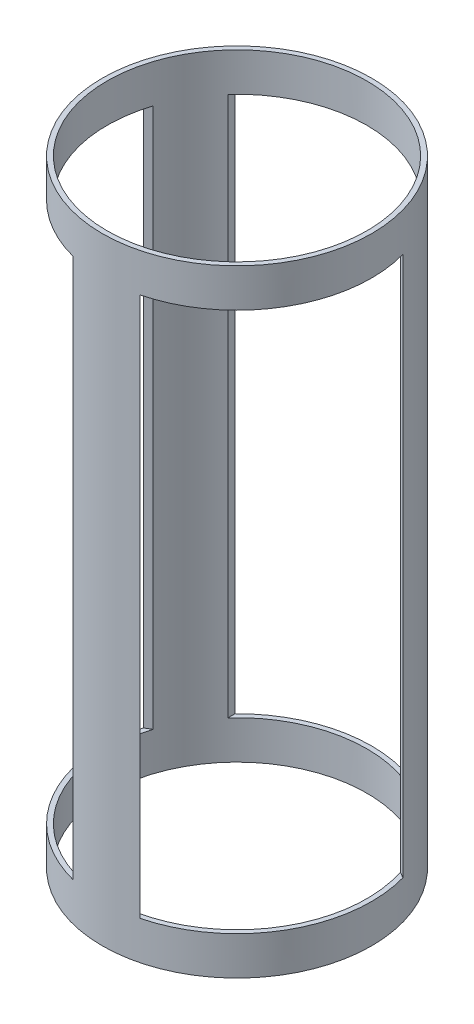
ISO-10303-21;
HEADER;
FILE_DESCRIPTION(('STEP AP214'),'2;1');
FILE_NAME('part.step','',(''),(''),'','','');
FILE_SCHEMA(('AUTOMOTIVE_DESIGN { 1 0 10303 214 1 1 1 1 }'));
ENDSEC;
DATA;
#1=APPLICATION_CONTEXT('core data for automotive mechanical design processes');
#2=APPLICATION_PROTOCOL_DEFINITION('international standard','automotive_design',2000,#1);
#3=PRODUCT_CONTEXT('',#1,'mechanical');
#4=PRODUCT('Part','Part','',(#3));
#5=PRODUCT_RELATED_PRODUCT_CATEGORY('part','',(#4));
#6=PRODUCT_DEFINITION_FORMATION('','',#4);
#7=PRODUCT_DEFINITION_CONTEXT('part definition',#1,'design');
#8=PRODUCT_DEFINITION('design','',#6,#7);
#9=PRODUCT_DEFINITION_SHAPE('','',#8);
#10=(LENGTH_UNIT() NAMED_UNIT(*) SI_UNIT(.MILLI.,.METRE.));
#11=(NAMED_UNIT(*) PLANE_ANGLE_UNIT() SI_UNIT($,.RADIAN.));
#12=(NAMED_UNIT(*) SI_UNIT($,.STERADIAN.) SOLID_ANGLE_UNIT());
#13=UNCERTAINTY_MEASURE_WITH_UNIT(LENGTH_MEASURE(1.E-05),#10,'distance_accuracy_value','');
#14=(GEOMETRIC_REPRESENTATION_CONTEXT(3) GLOBAL_UNCERTAINTY_ASSIGNED_CONTEXT((#13)) GLOBAL_UNIT_ASSIGNED_CONTEXT((#10,
#11,#12)) REPRESENTATION_CONTEXT('',''));
#15=CARTESIAN_POINT('',(0.,0.,0.));
#16=DIRECTION('',(0.,0.,1.));
#17=DIRECTION('',(1.,0.,0.));
#18=AXIS2_PLACEMENT_3D('',#15,#16,#17);
#19=CARTESIAN_POINT('',(0.,203.581,0.));
#20=DIRECTION('',(0.,1.,0.));
#21=DIRECTION('',(0.,0.,1.));
#22=AXIS2_PLACEMENT_3D('',#19,#20,#21);
#23=PLANE('',#22);
#24=CARTESIAN_POINT('',(0.,203.581,0.));
#25=DIRECTION('',(0.,1.,0.));
#26=DIRECTION('',(0.,0.,1.));
#27=AXIS2_PLACEMENT_3D('',#24,#25,#26);
#28=CIRCLE('',#27,88.9);
#29=CARTESIAN_POINT('',(0.,203.581,88.9));
#30=VERTEX_POINT('',#29);
#31=EDGE_CURVE('E226',#30,#30,#28,.T.);
#32=ORIENTED_EDGE('',*,*,#31,.T.);
#33=EDGE_LOOP('',(#32));
#34=FACE_BOUND('',#33,.T.);
#35=CARTESIAN_POINT('',(0.,203.581,0.));
#36=DIRECTION('',(0.,1.,0.));
#37=DIRECTION('',(0.,0.,1.));
#38=AXIS2_PLACEMENT_3D('',#35,#36,#37);
#39=CIRCLE('',#38,85.725);
#40=CARTESIAN_POINT('',(0.,203.581,85.725));
#41=VERTEX_POINT('',#40);
#42=EDGE_CURVE('E220',#41,#41,#39,.T.);
#43=ORIENTED_EDGE('',*,*,#42,.F.);
#44=EDGE_LOOP('',(#43));
#45=FACE_BOUND('',#44,.T.);
#46=ADVANCED_FACE('F41',(#34,#45),#23,.T.);
#47=CARTESIAN_POINT('',(0.,-203.581,0.));
#48=DIRECTION('',(0.,1.,0.));
#49=DIRECTION('',(0.,0.,1.));
#50=AXIS2_PLACEMENT_3D('',#47,#48,#49);
#51=PLANE('',#50);
#52=CARTESIAN_POINT('',(0.,-203.581,0.));
#53=DIRECTION('',(0.,1.,0.));
#54=DIRECTION('',(0.,0.,1.));
#55=AXIS2_PLACEMENT_3D('',#52,#53,#54);
#56=CIRCLE('',#55,88.9);
#57=CARTESIAN_POINT('',(0.,-203.581,88.9));
#58=VERTEX_POINT('',#57);
#59=EDGE_CURVE('E223',#58,#58,#56,.T.);
#60=ORIENTED_EDGE('',*,*,#59,.F.);
#61=EDGE_LOOP('',(#60));
#62=FACE_BOUND('',#61,.T.);
#63=CARTESIAN_POINT('',(0.,-203.581,0.));
#64=DIRECTION('',(0.,1.,0.));
#65=DIRECTION('',(0.,0.,1.));
#66=AXIS2_PLACEMENT_3D('',#63,#64,#65);
#67=CIRCLE('',#66,85.725);
#68=CARTESIAN_POINT('',(0.,-203.581,85.725));
#69=VERTEX_POINT('',#68);
#70=EDGE_CURVE('E200',#69,#69,#67,.T.);
#71=ORIENTED_EDGE('',*,*,#70,.T.);
#72=EDGE_LOOP('',(#71));
#73=FACE_BOUND('',#72,.T.);
#74=ADVANCED_FACE('F256',(#62,#73),#51,.F.);
#75=CARTESIAN_POINT('',(0.,203.581,0.));
#76=DIRECTION('',(0.,-1.,0.));
#77=DIRECTION('',(0.,0.,-1.));
#78=AXIS2_PLACEMENT_3D('',#75,#76,#77);
#79=CYLINDRICAL_SURFACE('',#78,88.9);
#80=CARTESIAN_POINT('',(0.,-178.181,0.));
#81=DIRECTION('',(0.,-1.,0.));
#82=DIRECTION('',(0.866025403784436,0.,0.500000000000004));
#83=AXIS2_PLACEMENT_3D('',#80,#81,#82);
#84=CIRCLE('',#83,88.9);
#85=CARTESIAN_POINT('',(22.1315367264145,-178.181,86.1011328736583));
#86=VERTEX_POINT('',#85);
#87=CARTESIAN_POINT('',(85.631536726415,-178.181,-23.8840934069651));
#88=VERTEX_POINT('',#87);
#89=EDGE_CURVE('E162',#86,#88,#84,.F.);
#90=ORIENTED_EDGE('',*,*,#89,.F.);
#91=DIRECTION('',(0.,-1.,0.));
#92=VECTOR('',#91,1.);
#93=CARTESIAN_POINT('',(22.1315367264145,203.581,86.1011328736583));
#94=LINE('',#93,#92);
#95=CARTESIAN_POINT('',(22.1315367264145,178.181,86.1011328736583));
#96=VERTEX_POINT('',#95);
#97=EDGE_CURVE('E167',#96,#86,#94,.T.);
#98=ORIENTED_EDGE('',*,*,#97,.F.);
#99=CARTESIAN_POINT('',(0.,178.181,0.));
#100=DIRECTION('',(0.,1.,0.));
#101=DIRECTION('',(-0.866025403784436,0.,-0.500000000000004));
#102=AXIS2_PLACEMENT_3D('',#99,#100,#101);
#103=CIRCLE('',#102,88.9);
#104=CARTESIAN_POINT('',(85.631536726415,178.181,-23.8840934069651));
#105=VERTEX_POINT('',#104);
#106=EDGE_CURVE('E141',#105,#96,#103,.F.);
#107=ORIENTED_EDGE('',*,*,#106,.F.);
#108=DIRECTION('',(0.,-1.,0.));
#109=VECTOR('',#108,1.);
#110=CARTESIAN_POINT('',(85.631536726415,203.581,-23.8840934069651));
#111=LINE('',#110,#109);
#112=EDGE_CURVE('E56',#88,#105,#111,.F.);
#113=ORIENTED_EDGE('',*,*,#112,.F.);
#114=EDGE_LOOP('',(#90,#98,#107,#113));
#115=FACE_BOUND('',#114,.T.);
#116=CARTESIAN_POINT('',(0.,-178.181,0.));
#117=DIRECTION('',(0.,-1.,0.));
#118=DIRECTION('',(-0.866025403784443,0.,0.499999999999992));
#119=AXIS2_PLACEMENT_3D('',#116,#117,#118);
#120=CIRCLE('',#119,88.9);
#121=CARTESIAN_POINT('',(-85.6315367264147,-178.181,-23.8840934069663));
#122=VERTEX_POINT('',#121);
#123=CARTESIAN_POINT('',(-22.1315367264157,-178.181,86.101132873658));
#124=VERTEX_POINT('',#123);
#125=EDGE_CURVE('E191',#122,#124,#120,.F.);
#126=ORIENTED_EDGE('',*,*,#125,.F.);
#127=DIRECTION('',(0.,-1.,0.));
#128=VECTOR('',#127,1.);
#129=CARTESIAN_POINT('',(-85.6315367264147,203.581,-23.8840934069663));
#130=LINE('',#129,#128);
#131=CARTESIAN_POINT('',(-85.6315367264147,178.181,-23.8840934069663));
#132=VERTEX_POINT('',#131);
#133=EDGE_CURVE('E142',#132,#122,#130,.T.);
#134=ORIENTED_EDGE('',*,*,#133,.F.);
#135=CARTESIAN_POINT('',(0.,178.181,0.));
#136=DIRECTION('',(0.,1.,0.));
#137=DIRECTION('',(0.866025403784443,0.,-0.499999999999992));
#138=AXIS2_PLACEMENT_3D('',#135,#136,#137);
#139=CIRCLE('',#138,88.9);
#140=CARTESIAN_POINT('',(-22.1315367264157,178.181,86.101132873658));
#141=VERTEX_POINT('',#140);
#142=EDGE_CURVE('E173',#141,#132,#139,.F.);
#143=ORIENTED_EDGE('',*,*,#142,.F.);
#144=DIRECTION('',(0.,-1.,0.));
#145=VECTOR('',#144,1.);
#146=CARTESIAN_POINT('',(-22.1315367264157,203.581,86.101132873658));
#147=LINE('',#146,#145);
#148=EDGE_CURVE('E64',#124,#141,#147,.F.);
#149=ORIENTED_EDGE('',*,*,#148,.F.);
#150=EDGE_LOOP('',(#126,#134,#143,#149));
#151=FACE_BOUND('',#150,.T.);
#152=CARTESIAN_POINT('',(0.,-178.181,0.));
#153=DIRECTION('',(0.,-1.,0.));
#154=DIRECTION('',(0.,0.,-1.));
#155=AXIS2_PLACEMENT_3D('',#152,#153,#154);
#156=CIRCLE('',#155,88.9);
#157=CARTESIAN_POINT('',(63.5,-178.181,-62.2170394666927));
#158=VERTEX_POINT('',#157);
#159=CARTESIAN_POINT('',(-63.5,-178.181,-62.2170394666927));
#160=VERTEX_POINT('',#159);
#161=EDGE_CURVE('E201',#158,#160,#156,.F.);
#162=ORIENTED_EDGE('',*,*,#161,.F.);
#163=DIRECTION('',(0.,-1.,0.));
#164=VECTOR('',#163,1.);
#165=CARTESIAN_POINT('',(63.5,203.581,-62.2170394666927));
#166=LINE('',#165,#164);
#167=CARTESIAN_POINT('',(63.5,178.181,-62.2170394666927));
#168=VERTEX_POINT('',#167);
#169=EDGE_CURVE('E204',#168,#158,#166,.T.);
#170=ORIENTED_EDGE('',*,*,#169,.F.);
#171=CARTESIAN_POINT('',(0.,178.181,0.));
#172=DIRECTION('',(0.,1.,0.));
#173=DIRECTION('',(0.,0.,1.));
#174=AXIS2_PLACEMENT_3D('',#171,#172,#173);
#175=CIRCLE('',#174,88.9);
#176=CARTESIAN_POINT('',(-63.5,178.181,-62.2170394666927));
#177=VERTEX_POINT('',#176);
#178=EDGE_CURVE('E207',#177,#168,#175,.F.);
#179=ORIENTED_EDGE('',*,*,#178,.F.);
#180=DIRECTION('',(0.,-1.,0.));
#181=VECTOR('',#180,1.);
#182=CARTESIAN_POINT('',(-63.5,203.581,-62.2170394666927));
#183=LINE('',#182,#181);
#184=EDGE_CURVE('E198',#160,#177,#183,.F.);
#185=ORIENTED_EDGE('',*,*,#184,.F.);
#186=EDGE_LOOP('',(#162,#170,#179,#185));
#187=FACE_BOUND('',#186,.T.);
#188=ORIENTED_EDGE('',*,*,#31,.F.);
#189=EDGE_LOOP('',(#188));
#190=FACE_BOUND('',#189,.T.);
#191=ORIENTED_EDGE('',*,*,#59,.T.);
#192=EDGE_LOOP('',(#191));
#193=FACE_BOUND('',#192,.T.);
#194=ADVANCED_FACE('F43',(#115,#151,#187,#190,#193),#79,.T.);
#195=CARTESIAN_POINT('',(0.,203.581,0.));
#196=DIRECTION('',(0.,-1.,0.));
#197=DIRECTION('',(0.,0.,-1.));
#198=AXIS2_PLACEMENT_3D('',#195,#196,#197);
#199=CYLINDRICAL_SURFACE('',#198,85.725);
#200=DIRECTION('',(0.,-1.,0.));
#201=VECTOR('',#200,1.);
#202=CARTESIAN_POINT('',(18.1237828798855,203.581,83.787255111519));
#203=LINE('',#202,#201);
#204=CARTESIAN_POINT('',(18.1237828798855,-178.181,83.787255111519));
#205=VERTEX_POINT('',#204);
#206=CARTESIAN_POINT('',(18.1237828798855,178.181,83.787255111519));
#207=VERTEX_POINT('',#206);
#208=EDGE_CURVE('E165',#205,#207,#203,.F.);
#209=ORIENTED_EDGE('',*,*,#208,.F.);
#210=CARTESIAN_POINT('',(0.,-178.181,0.));
#211=DIRECTION('',(0.,-1.,0.));
#212=DIRECTION('',(0.866025403784436,0.,0.500000000000004));
#213=AXIS2_PLACEMENT_3D('',#210,#211,#212);
#214=CIRCLE('',#213,85.725);
#215=CARTESIAN_POINT('',(81.623782879886,-178.181,-26.1979711691044));
#216=VERTEX_POINT('',#215);
#217=EDGE_CURVE('E151',#216,#205,#214,.T.);
#218=ORIENTED_EDGE('',*,*,#217,.F.);
#219=DIRECTION('',(0.,-1.,0.));
#220=VECTOR('',#219,1.);
#221=CARTESIAN_POINT('',(81.623782879886,203.581,-26.1979711691044));
#222=LINE('',#221,#220);
#223=CARTESIAN_POINT('',(81.623782879886,178.181,-26.1979711691044));
#224=VERTEX_POINT('',#223);
#225=EDGE_CURVE('E145',#224,#216,#222,.T.);
#226=ORIENTED_EDGE('',*,*,#225,.F.);
#227=CARTESIAN_POINT('',(0.,178.181,0.));
#228=DIRECTION('',(0.,1.,0.));
#229=DIRECTION('',(-0.866025403784436,0.,-0.500000000000004));
#230=AXIS2_PLACEMENT_3D('',#227,#228,#229);
#231=CIRCLE('',#230,85.725);
#232=EDGE_CURVE('E132',#207,#224,#231,.T.);
#233=ORIENTED_EDGE('',*,*,#232,.F.);
#234=EDGE_LOOP('',(#209,#218,#226,#233));
#235=FACE_BOUND('',#234,.T.);
#236=DIRECTION('',(0.,-1.,0.));
#237=VECTOR('',#236,1.);
#238=CARTESIAN_POINT('',(-81.6237828798856,203.581,-26.1979711691055));
#239=LINE('',#238,#237);
#240=CARTESIAN_POINT('',(-81.6237828798856,-178.181,-26.1979711691055));
#241=VERTEX_POINT('',#240);
#242=CARTESIAN_POINT('',(-81.6237828798857,178.181,-26.1979711691055));
#243=VERTEX_POINT('',#242);
#244=EDGE_CURVE('E194',#241,#243,#239,.F.);
#245=ORIENTED_EDGE('',*,*,#244,.F.);
#246=CARTESIAN_POINT('',(0.,-178.181,0.));
#247=DIRECTION('',(0.,-1.,0.));
#248=DIRECTION('',(-0.866025403784443,0.,0.499999999999992));
#249=AXIS2_PLACEMENT_3D('',#246,#247,#248);
#250=CIRCLE('',#249,85.725);
#251=CARTESIAN_POINT('',(-18.1237828798867,-178.181,83.7872551115187));
#252=VERTEX_POINT('',#251);
#253=EDGE_CURVE('E186',#252,#241,#250,.T.);
#254=ORIENTED_EDGE('',*,*,#253,.F.);
#255=DIRECTION('',(0.,-1.,0.));
#256=VECTOR('',#255,1.);
#257=CARTESIAN_POINT('',(-18.1237828798867,203.581,83.7872551115187));
#258=LINE('',#257,#256);
#259=CARTESIAN_POINT('',(-18.1237828798867,178.181,83.7872551115187));
#260=VERTEX_POINT('',#259);
#261=EDGE_CURVE('E180',#260,#252,#258,.T.);
#262=ORIENTED_EDGE('',*,*,#261,.F.);
#263=CARTESIAN_POINT('',(0.,178.181,0.));
#264=DIRECTION('',(0.,1.,0.));
#265=DIRECTION('',(0.866025403784443,0.,-0.499999999999992));
#266=AXIS2_PLACEMENT_3D('',#263,#264,#265);
#267=CIRCLE('',#266,85.725);
#268=EDGE_CURVE('E171',#243,#260,#267,.T.);
#269=ORIENTED_EDGE('',*,*,#268,.F.);
#270=EDGE_LOOP('',(#245,#254,#262,#269));
#271=FACE_BOUND('',#270,.T.);
#272=DIRECTION('',(0.,-1.,0.));
#273=VECTOR('',#272,1.);
#274=CARTESIAN_POINT('',(63.5,203.581,-57.5892839424141));
#275=LINE('',#274,#273);
#276=CARTESIAN_POINT('',(63.5,-178.181,-57.5892839424141));
#277=VERTEX_POINT('',#276);
#278=CARTESIAN_POINT('',(63.5,178.181,-57.5892839424141));
#279=VERTEX_POINT('',#278);
#280=EDGE_CURVE('E11',#277,#279,#275,.F.);
#281=ORIENTED_EDGE('',*,*,#280,.F.);
#282=CARTESIAN_POINT('',(0.,-178.181,0.));
#283=DIRECTION('',(0.,-1.,0.));
#284=DIRECTION('',(0.,0.,-1.));
#285=AXIS2_PLACEMENT_3D('',#282,#283,#284);
#286=CIRCLE('',#285,85.725);
#287=CARTESIAN_POINT('',(-63.5,-178.181,-57.5892839424141));
#288=VERTEX_POINT('',#287);
#289=EDGE_CURVE('E49',#288,#277,#286,.T.);
#290=ORIENTED_EDGE('',*,*,#289,.F.);
#291=DIRECTION('',(0.,-1.,0.));
#292=VECTOR('',#291,1.);
#293=CARTESIAN_POINT('',(-63.5,203.581,-57.5892839424141));
#294=LINE('',#293,#292);
#295=CARTESIAN_POINT('',(-63.5,178.181,-57.5892839424141));
#296=VERTEX_POINT('',#295);
#297=EDGE_CURVE('E233',#296,#288,#294,.T.);
#298=ORIENTED_EDGE('',*,*,#297,.F.);
#299=CARTESIAN_POINT('',(0.,178.181,0.));
#300=DIRECTION('',(0.,1.,0.));
#301=DIRECTION('',(0.,0.,1.));
#302=AXIS2_PLACEMENT_3D('',#299,#300,#301);
#303=CIRCLE('',#302,85.725);
#304=EDGE_CURVE('E229',#279,#296,#303,.T.);
#305=ORIENTED_EDGE('',*,*,#304,.F.);
#306=EDGE_LOOP('',(#281,#290,#298,#305));
#307=FACE_BOUND('',#306,.T.);
#308=ORIENTED_EDGE('',*,*,#42,.T.);
#309=EDGE_LOOP('',(#308));
#310=FACE_BOUND('',#309,.T.);
#311=ORIENTED_EDGE('',*,*,#70,.F.);
#312=EDGE_LOOP('',(#311));
#313=FACE_BOUND('',#312,.T.);
#314=ADVANCED_FACE('F149',(#235,#271,#307,#310,#313),#199,.F.);
#315=CARTESIAN_POINT('',(63.5,-178.181,-88.901));
#316=DIRECTION('',(1.,0.,0.));
#317=DIRECTION('',(0.,0.,-1.));
#318=AXIS2_PLACEMENT_3D('',#315,#316,#317);
#319=PLANE('',#318);
#320=ORIENTED_EDGE('',*,*,#280,.T.);
#321=DIRECTION('',(0.,0.,1.));
#322=VECTOR('',#321,1.);
#323=CARTESIAN_POINT('',(63.5,178.181,-88.901));
#324=LINE('',#323,#322);
#325=EDGE_CURVE('E170',#168,#279,#324,.T.);
#326=ORIENTED_EDGE('',*,*,#325,.F.);
#327=ORIENTED_EDGE('',*,*,#169,.T.);
#328=DIRECTION('',(0.,0.,1.));
#329=VECTOR('',#328,1.);
#330=CARTESIAN_POINT('',(63.5,-178.181,-88.901));
#331=LINE('',#330,#329);
#332=EDGE_CURVE('E211',#158,#277,#331,.T.);
#333=ORIENTED_EDGE('',*,*,#332,.T.);
#334=EDGE_LOOP('',(#320,#326,#327,#333));
#335=FACE_BOUND('',#334,.T.);
#336=ADVANCED_FACE('F241',(#335),#319,.F.);
#337=CARTESIAN_POINT('',(-63.5,-178.181,-88.901));
#338=DIRECTION('',(0.,-1.,0.));
#339=DIRECTION('',(0.,0.,-1.));
#340=AXIS2_PLACEMENT_3D('',#337,#338,#339);
#341=PLANE('',#340);
#342=ORIENTED_EDGE('',*,*,#289,.T.);
#343=ORIENTED_EDGE('',*,*,#332,.F.);
#344=ORIENTED_EDGE('',*,*,#161,.T.);
#345=DIRECTION('',(0.,0.,1.));
#346=VECTOR('',#345,1.);
#347=CARTESIAN_POINT('',(-63.5,-178.181,-88.901));
#348=LINE('',#347,#346);
#349=EDGE_CURVE('E214',#160,#288,#348,.T.);
#350=ORIENTED_EDGE('',*,*,#349,.T.);
#351=EDGE_LOOP('',(#342,#343,#344,#350));
#352=FACE_BOUND('',#351,.T.);
#353=ADVANCED_FACE('F236',(#352),#341,.F.);
#354=CARTESIAN_POINT('',(-63.5,-178.181,-88.901));
#355=DIRECTION('',(-1.,0.,0.));
#356=DIRECTION('',(0.,0.,1.));
#357=AXIS2_PLACEMENT_3D('',#354,#355,#356);
#358=PLANE('',#357);
#359=ORIENTED_EDGE('',*,*,#297,.T.);
#360=ORIENTED_EDGE('',*,*,#349,.F.);
#361=ORIENTED_EDGE('',*,*,#184,.T.);
#362=DIRECTION('',(0.,0.,1.));
#363=VECTOR('',#362,1.);
#364=CARTESIAN_POINT('',(-63.5,178.181,-88.901));
#365=LINE('',#364,#363);
#366=EDGE_CURVE('E210',#177,#296,#365,.T.);
#367=ORIENTED_EDGE('',*,*,#366,.T.);
#368=EDGE_LOOP('',(#359,#360,#361,#367));
#369=FACE_BOUND('',#368,.T.);
#370=ADVANCED_FACE('F251',(#369),#358,.F.);
#371=CARTESIAN_POINT('',(-63.5,178.181,-88.901));
#372=DIRECTION('',(0.,1.,0.));
#373=DIRECTION('',(0.,0.,1.));
#374=AXIS2_PLACEMENT_3D('',#371,#372,#373);
#375=PLANE('',#374);
#376=ORIENTED_EDGE('',*,*,#304,.T.);
#377=ORIENTED_EDGE('',*,*,#366,.F.);
#378=ORIENTED_EDGE('',*,*,#178,.T.);
#379=ORIENTED_EDGE('',*,*,#325,.T.);
#380=EDGE_LOOP('',(#376,#377,#378,#379));
#381=FACE_BOUND('',#380,.T.);
#382=ADVANCED_FACE('F248',(#381),#375,.F.);
#383=CARTESIAN_POINT('',(-108.74052442184,-178.181,-10.5421131403129));
#384=DIRECTION('',(-0.499999999999992,0.,-0.866025403784443));
#385=DIRECTION('',(-0.866025403784443,0.,0.499999999999992));
#386=AXIS2_PLACEMENT_3D('',#383,#384,#385);
#387=PLANE('',#386);
#388=ORIENTED_EDGE('',*,*,#244,.T.);
#389=DIRECTION('',(0.866025403784443,0.,-0.499999999999992));
#390=VECTOR('',#389,1.);
#391=CARTESIAN_POINT('',(-108.74052442184,178.181,-10.5421131403129));
#392=LINE('',#391,#390);
#393=EDGE_CURVE('E177',#132,#243,#392,.T.);
#394=ORIENTED_EDGE('',*,*,#393,.F.);
#395=ORIENTED_EDGE('',*,*,#133,.T.);
#396=DIRECTION('',(0.866025403784443,0.,-0.499999999999992));
#397=VECTOR('',#396,1.);
#398=CARTESIAN_POINT('',(-108.74052442184,-178.181,-10.5421131403129));
#399=LINE('',#398,#397);
#400=EDGE_CURVE('E188',#122,#241,#399,.T.);
#401=ORIENTED_EDGE('',*,*,#400,.T.);
#402=EDGE_LOOP('',(#388,#394,#395,#401));
#403=FACE_BOUND('',#402,.T.);
#404=ADVANCED_FACE('F303',(#403),#387,.F.);
#405=CARTESIAN_POINT('',(-45.2405244218413,-178.181,99.4431131403114));
#406=DIRECTION('',(0.,-1.,0.));
#407=DIRECTION('',(-0.866025403784443,0.,0.499999999999992));
#408=AXIS2_PLACEMENT_3D('',#405,#406,#407);
#409=PLANE('',#408);
#410=ORIENTED_EDGE('',*,*,#253,.T.);
#411=ORIENTED_EDGE('',*,*,#400,.F.);
#412=ORIENTED_EDGE('',*,*,#125,.T.);
#413=DIRECTION('',(0.866025403784443,0.,-0.499999999999992));
#414=VECTOR('',#413,1.);
#415=CARTESIAN_POINT('',(-45.2405244218413,-178.181,99.4431131403114));
#416=LINE('',#415,#414);
#417=EDGE_CURVE('E182',#124,#252,#416,.T.);
#418=ORIENTED_EDGE('',*,*,#417,.T.);
#419=EDGE_LOOP('',(#410,#411,#412,#418));
#420=FACE_BOUND('',#419,.T.);
#421=ADVANCED_FACE('F308',(#420),#409,.F.);
#422=CARTESIAN_POINT('',(-45.2405244218413,-178.181,99.4431131403114));
#423=DIRECTION('',(0.499999999999992,0.,0.866025403784443));
#424=DIRECTION('',(0.866025403784443,0.,-0.499999999999992));
#425=AXIS2_PLACEMENT_3D('',#422,#423,#424);
#426=PLANE('',#425);
#427=ORIENTED_EDGE('',*,*,#261,.T.);
#428=ORIENTED_EDGE('',*,*,#417,.F.);
#429=ORIENTED_EDGE('',*,*,#148,.T.);
#430=DIRECTION('',(0.866025403784443,0.,-0.499999999999992));
#431=VECTOR('',#430,1.);
#432=CARTESIAN_POINT('',(-45.2405244218413,178.181,99.4431131403114));
#433=LINE('',#432,#431);
#434=EDGE_CURVE('E175',#141,#260,#433,.T.);
#435=ORIENTED_EDGE('',*,*,#434,.T.);
#436=EDGE_LOOP('',(#427,#428,#429,#435));
#437=FACE_BOUND('',#436,.T.);
#438=ADVANCED_FACE('F318',(#437),#426,.F.);
#439=CARTESIAN_POINT('',(-45.2405244218413,178.181,99.4431131403114));
#440=DIRECTION('',(0.,1.,0.));
#441=DIRECTION('',(0.866025403784443,0.,-0.499999999999992));
#442=AXIS2_PLACEMENT_3D('',#439,#440,#441);
#443=PLANE('',#442);
#444=ORIENTED_EDGE('',*,*,#268,.T.);
#445=ORIENTED_EDGE('',*,*,#434,.F.);
#446=ORIENTED_EDGE('',*,*,#142,.T.);
#447=ORIENTED_EDGE('',*,*,#393,.T.);
#448=EDGE_LOOP('',(#444,#445,#446,#447));
#449=FACE_BOUND('',#448,.T.);
#450=ADVANCED_FACE('F328',(#449),#443,.F.);
#451=CARTESIAN_POINT('',(45.2405244218399,-178.181,99.4431131403121));
#452=DIRECTION('',(-0.500000000000004,0.,0.866025403784436));
#453=DIRECTION('',(0.866025403784436,0.,0.500000000000004));
#454=AXIS2_PLACEMENT_3D('',#451,#452,#453);
#455=PLANE('',#454);
#456=ORIENTED_EDGE('',*,*,#208,.T.);
#457=DIRECTION('',(-0.866025403784436,0.,-0.500000000000004));
#458=VECTOR('',#457,1.);
#459=CARTESIAN_POINT('',(45.2405244218399,178.181,99.4431131403121));
#460=LINE('',#459,#458);
#461=EDGE_CURVE('E137',#96,#207,#460,.T.);
#462=ORIENTED_EDGE('',*,*,#461,.F.);
#463=ORIENTED_EDGE('',*,*,#97,.T.);
#464=DIRECTION('',(-0.866025403784436,0.,-0.500000000000004));
#465=VECTOR('',#464,1.);
#466=CARTESIAN_POINT('',(45.2405244218399,-178.181,99.4431131403121));
#467=LINE('',#466,#465);
#468=EDGE_CURVE('E159',#86,#205,#467,.T.);
#469=ORIENTED_EDGE('',*,*,#468,.T.);
#470=EDGE_LOOP('',(#456,#462,#463,#469));
#471=FACE_BOUND('',#470,.T.);
#472=ADVANCED_FACE('F337',(#471),#455,.F.);
#473=CARTESIAN_POINT('',(108.74052442184,-178.181,-10.5421131403113));
#474=DIRECTION('',(0.,-1.,0.));
#475=DIRECTION('',(0.866025403784436,0.,0.500000000000004));
#476=AXIS2_PLACEMENT_3D('',#473,#474,#475);
#477=PLANE('',#476);
#478=ORIENTED_EDGE('',*,*,#217,.T.);
#479=ORIENTED_EDGE('',*,*,#468,.F.);
#480=ORIENTED_EDGE('',*,*,#89,.T.);
#481=DIRECTION('',(-0.866025403784436,0.,-0.500000000000004));
#482=VECTOR('',#481,1.);
#483=CARTESIAN_POINT('',(108.74052442184,-178.181,-10.5421131403113));
#484=LINE('',#483,#482);
#485=EDGE_CURVE('E152',#88,#216,#484,.T.);
#486=ORIENTED_EDGE('',*,*,#485,.T.);
#487=EDGE_LOOP('',(#478,#479,#480,#486));
#488=FACE_BOUND('',#487,.T.);
#489=ADVANCED_FACE('F347',(#488),#477,.F.);
#490=CARTESIAN_POINT('',(108.74052442184,-178.181,-10.5421131403113));
#491=DIRECTION('',(0.500000000000004,0.,-0.866025403784436));
#492=DIRECTION('',(-0.866025403784436,0.,-0.500000000000004));
#493=AXIS2_PLACEMENT_3D('',#490,#491,#492);
#494=PLANE('',#493);
#495=ORIENTED_EDGE('',*,*,#225,.T.);
#496=ORIENTED_EDGE('',*,*,#485,.F.);
#497=ORIENTED_EDGE('',*,*,#112,.T.);
#498=DIRECTION('',(-0.866025403784436,0.,-0.500000000000004));
#499=VECTOR('',#498,1.);
#500=CARTESIAN_POINT('',(108.74052442184,178.181,-10.5421131403113));
#501=LINE('',#500,#499);
#502=EDGE_CURVE('E134',#105,#224,#501,.T.);
#503=ORIENTED_EDGE('',*,*,#502,.T.);
#504=EDGE_LOOP('',(#495,#496,#497,#503));
#505=FACE_BOUND('',#504,.T.);
#506=ADVANCED_FACE('F144',(#505),#494,.F.);
#507=CARTESIAN_POINT('',(108.74052442184,178.181,-10.5421131403113));
#508=DIRECTION('',(0.,1.,0.));
#509=DIRECTION('',(-0.866025403784436,0.,-0.500000000000004));
#510=AXIS2_PLACEMENT_3D('',#507,#508,#509);
#511=PLANE('',#510);
#512=ORIENTED_EDGE('',*,*,#232,.T.);
#513=ORIENTED_EDGE('',*,*,#502,.F.);
#514=ORIENTED_EDGE('',*,*,#106,.T.);
#515=ORIENTED_EDGE('',*,*,#461,.T.);
#516=EDGE_LOOP('',(#512,#513,#514,#515));
#517=FACE_BOUND('',#516,.T.);
#518=ADVANCED_FACE('F133',(#517),#511,.F.);
#519=CLOSED_SHELL('',(#46,#74,#194,#314,#336,#353,#370,#382,#404,#421,#438,#450,#472,#489,#506,#518));
#520=MANIFOLD_SOLID_BREP('B2',#519);
#521=ADVANCED_BREP_SHAPE_REPRESENTATION('',(#18,#520),#14);
#522=SHAPE_DEFINITION_REPRESENTATION(#9,#521);
ENDSEC;
END-ISO-10303-21;
